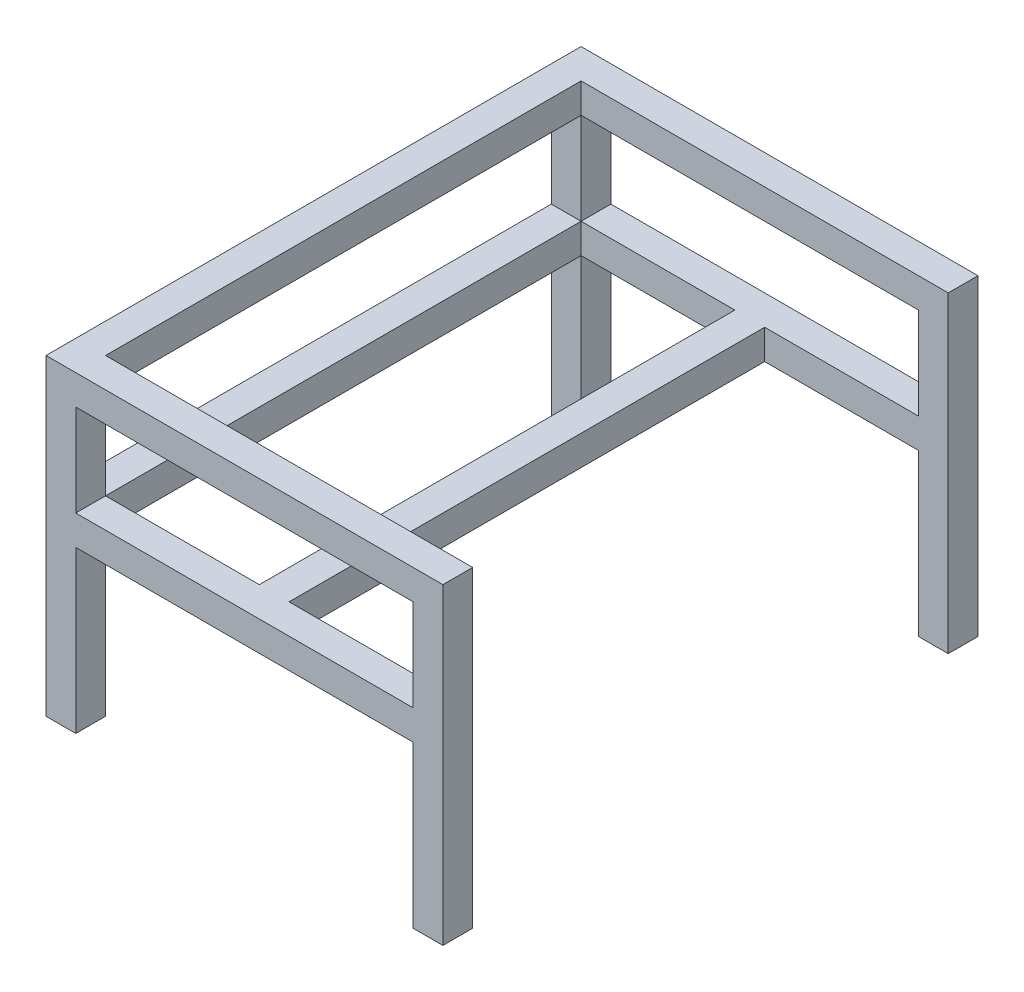
ISO-10303-21;
HEADER;
FILE_DESCRIPTION(('STEP AP214'),'2;1');
FILE_NAME('part.step','',(''),(''),'','','');
FILE_SCHEMA(('AUTOMOTIVE_DESIGN { 1 0 10303 214 1 1 1 1 }'));
ENDSEC;
DATA;
#1=APPLICATION_CONTEXT('core data for automotive mechanical design processes');
#2=APPLICATION_PROTOCOL_DEFINITION('international standard','automotive_design',2000,#1);
#3=PRODUCT_CONTEXT('',#1,'mechanical');
#4=PRODUCT('Part','Part','',(#3));
#5=PRODUCT_RELATED_PRODUCT_CATEGORY('part','',(#4));
#6=PRODUCT_DEFINITION_FORMATION('','',#4);
#7=PRODUCT_DEFINITION_CONTEXT('part definition',#1,'design');
#8=PRODUCT_DEFINITION('design','',#6,#7);
#9=PRODUCT_DEFINITION_SHAPE('','',#8);
#10=(LENGTH_UNIT() NAMED_UNIT(*) SI_UNIT(.MILLI.,.METRE.));
#11=(NAMED_UNIT(*) PLANE_ANGLE_UNIT() SI_UNIT($,.RADIAN.));
#12=(NAMED_UNIT(*) SI_UNIT($,.STERADIAN.) SOLID_ANGLE_UNIT());
#13=UNCERTAINTY_MEASURE_WITH_UNIT(LENGTH_MEASURE(1.E-05),#10,'distance_accuracy_value','');
#14=(GEOMETRIC_REPRESENTATION_CONTEXT(3) GLOBAL_UNCERTAINTY_ASSIGNED_CONTEXT((#13)) GLOBAL_UNIT_ASSIGNED_CONTEXT((#10,
#11,#12)) REPRESENTATION_CONTEXT('',''));
#15=CARTESIAN_POINT('',(0.,0.,0.));
#16=DIRECTION('',(0.,0.,1.));
#17=DIRECTION('',(1.,0.,0.));
#18=AXIS2_PLACEMENT_3D('',#15,#16,#17);
#19=CARTESIAN_POINT('',(508.1,723.8,608.8));
#20=DIRECTION('',(0.,0.,1.));
#21=DIRECTION('',(1.,0.,0.));
#22=AXIS2_PLACEMENT_3D('',#19,#20,#21);
#23=PLANE('',#22);
#24=DIRECTION('',(0.,-1.,0.));
#25=VECTOR('',#24,1.);
#26=CARTESIAN_POINT('',(-38.1,412.6,608.8));
#27=LINE('',#26,#25);
#28=CARTESIAN_POINT('',(-38.1,488.8,608.800000000001));
#29=VERTEX_POINT('',#28);
#30=CARTESIAN_POINT('',(-38.1,412.6,608.800000000001));
#31=VERTEX_POINT('',#30);
#32=EDGE_CURVE('E261',#29,#31,#27,.T.);
#33=ORIENTED_EDGE('',*,*,#32,.T.);
#34=DIRECTION('',(-1.,0.,0.));
#35=VECTOR('',#34,1.);
#36=CARTESIAN_POINT('',(431.9,412.6,608.800000000001));
#37=LINE('',#36,#35);
#38=CARTESIAN_POINT('',(-431.900000000001,412.6,608.8));
#39=VERTEX_POINT('',#38);
#40=EDGE_CURVE('E278',#31,#39,#37,.T.);
#41=ORIENTED_EDGE('',*,*,#40,.T.);
#42=DIRECTION('',(0.,1.,0.));
#43=VECTOR('',#42,1.);
#44=CARTESIAN_POINT('',(-431.900000000001,488.8,608.800000000001));
#45=LINE('',#44,#43);
#46=CARTESIAN_POINT('',(-431.9,488.8,608.800000000001));
#47=VERTEX_POINT('',#46);
#48=EDGE_CURVE('E275',#39,#47,#45,.T.);
#49=ORIENTED_EDGE('',*,*,#48,.T.);
#50=DIRECTION('',(1.,0.,0.));
#51=VECTOR('',#50,1.);
#52=CARTESIAN_POINT('',(431.9,488.8,608.800000000001));
#53=LINE('',#52,#51);
#54=EDGE_CURVE('E250',#47,#29,#53,.T.);
#55=ORIENTED_EDGE('',*,*,#54,.T.);
#56=EDGE_LOOP('',(#33,#41,#49,#55));
#57=FACE_BOUND('',#56,.T.);
#58=ADVANCED_FACE('F35',(#57),#23,.F.);
#59=DIRECTION('',(0.,1.,0.));
#60=VECTOR('',#59,1.);
#61=CARTESIAN_POINT('',(38.1,412.6,608.8));
#62=LINE('',#61,#60);
#63=CARTESIAN_POINT('',(38.1,412.6,608.800000000001));
#64=VERTEX_POINT('',#63);
#65=CARTESIAN_POINT('',(38.1,488.8,608.8));
#66=VERTEX_POINT('',#65);
#67=EDGE_CURVE('E254',#64,#66,#62,.T.);
#68=ORIENTED_EDGE('',*,*,#67,.T.);
#69=CARTESIAN_POINT('',(431.9,488.799999999999,608.8));
#70=VERTEX_POINT('',#69);
#71=EDGE_CURVE('E240',#66,#70,#53,.T.);
#72=ORIENTED_EDGE('',*,*,#71,.T.);
#73=DIRECTION('',(0.,-1.,0.));
#74=VECTOR('',#73,1.);
#75=CARTESIAN_POINT('',(431.9,723.8,608.8));
#76=LINE('',#75,#74);
#77=CARTESIAN_POINT('',(431.9,723.8,608.8));
#78=VERTEX_POINT('',#77);
#79=EDGE_CURVE('E453',#78,#70,#76,.T.);
#80=ORIENTED_EDGE('',*,*,#79,.F.);
#81=DIRECTION('',(1.,0.,0.));
#82=VECTOR('',#81,1.);
#83=CARTESIAN_POINT('',(-431.9,723.8,608.8));
#84=LINE('',#83,#82);
#85=CARTESIAN_POINT('',(-431.9,723.8,608.8));
#86=VERTEX_POINT('',#85);
#87=EDGE_CURVE('E348',#86,#78,#84,.T.);
#88=ORIENTED_EDGE('',*,*,#87,.F.);
#89=DIRECTION('',(0.,1.,0.));
#90=VECTOR('',#89,1.);
#91=CARTESIAN_POINT('',(-431.9,723.8,608.8));
#92=LINE('',#91,#90);
#93=CARTESIAN_POINT('',(-431.9,800.,608.8));
#94=VERTEX_POINT('',#93);
#95=EDGE_CURVE('E358',#86,#94,#92,.T.);
#96=ORIENTED_EDGE('',*,*,#95,.T.);
#97=DIRECTION('',(1.,0.,0.));
#98=VECTOR('',#97,1.);
#99=CARTESIAN_POINT('',(-431.9,800.,608.8));
#100=LINE('',#99,#98);
#101=CARTESIAN_POINT('',(508.1,800.,608.8));
#102=VERTEX_POINT('',#101);
#103=EDGE_CURVE('E345',#94,#102,#100,.T.);
#104=ORIENTED_EDGE('',*,*,#103,.T.);
#105=DIRECTION('',(0.,-1.,0.));
#106=VECTOR('',#105,1.);
#107=CARTESIAN_POINT('',(508.1,723.8,608.8));
#108=LINE('',#107,#106);
#109=CARTESIAN_POINT('',(508.1,0.,608.8));
#110=VERTEX_POINT('',#109);
#111=EDGE_CURVE('E413',#102,#110,#108,.T.);
#112=ORIENTED_EDGE('',*,*,#111,.T.);
#113=DIRECTION('',(-1.,0.,0.));
#114=VECTOR('',#113,1.);
#115=CARTESIAN_POINT('',(508.1,0.,608.8));
#116=LINE('',#115,#114);
#117=CARTESIAN_POINT('',(431.9,0.,608.8));
#118=VERTEX_POINT('',#117);
#119=EDGE_CURVE('E360',#110,#118,#116,.T.);
#120=ORIENTED_EDGE('',*,*,#119,.T.);
#121=CARTESIAN_POINT('',(431.9,412.6,608.800000000001));
#122=VERTEX_POINT('',#121);
#123=EDGE_CURVE('E390',#122,#118,#76,.T.);
#124=ORIENTED_EDGE('',*,*,#123,.F.);
#125=EDGE_CURVE('E251',#122,#64,#37,.T.);
#126=ORIENTED_EDGE('',*,*,#125,.T.);
#127=EDGE_LOOP('',(#68,#72,#80,#88,#96,#104,#112,#120,#124,#126));
#128=FACE_BOUND('',#127,.T.);
#129=ADVANCED_FACE('F255',(#128),#23,.F.);
#130=CARTESIAN_POINT('',(431.9,723.8,-608.8));
#131=DIRECTION('',(0.,0.,-1.));
#132=DIRECTION('',(-1.,0.,0.));
#133=AXIS2_PLACEMENT_3D('',#130,#131,#132);
#134=PLANE('',#133);
#135=DIRECTION('',(0.,-1.,0.));
#136=VECTOR('',#135,1.);
#137=CARTESIAN_POINT('',(-38.1,412.6,-608.8));
#138=LINE('',#137,#136);
#139=CARTESIAN_POINT('',(-38.1,488.8,-608.8));
#140=VERTEX_POINT('',#139);
#141=CARTESIAN_POINT('',(-38.1,412.6,-608.8));
#142=VERTEX_POINT('',#141);
#143=EDGE_CURVE('E274',#140,#142,#138,.T.);
#144=ORIENTED_EDGE('',*,*,#143,.F.);
#145=DIRECTION('',(-1.,0.,0.));
#146=VECTOR('',#145,1.);
#147=CARTESIAN_POINT('',(-431.9,488.8,-608.8));
#148=LINE('',#147,#146);
#149=CARTESIAN_POINT('',(-431.9,488.8,-608.8));
#150=VERTEX_POINT('',#149);
#151=EDGE_CURVE('E300',#140,#150,#148,.T.);
#152=ORIENTED_EDGE('',*,*,#151,.T.);
#153=DIRECTION('',(0.,-1.,0.));
#154=VECTOR('',#153,1.);
#155=CARTESIAN_POINT('',(-431.9,488.8,-608.8));
#156=LINE('',#155,#154);
#157=CARTESIAN_POINT('',(-431.9,412.6,-608.8));
#158=VERTEX_POINT('',#157);
#159=EDGE_CURVE('E297',#150,#158,#156,.T.);
#160=ORIENTED_EDGE('',*,*,#159,.T.);
#161=DIRECTION('',(1.,0.,0.));
#162=VECTOR('',#161,1.);
#163=CARTESIAN_POINT('',(-431.9,412.6,-608.8));
#164=LINE('',#163,#162);
#165=EDGE_CURVE('E58',#158,#142,#164,.T.);
#166=ORIENTED_EDGE('',*,*,#165,.T.);
#167=EDGE_LOOP('',(#144,#152,#160,#166));
#168=FACE_BOUND('',#167,.T.);
#169=ADVANCED_FACE('F550',(#168),#134,.F.);
#170=DIRECTION('',(0.,1.,0.));
#171=VECTOR('',#170,1.);
#172=CARTESIAN_POINT('',(38.1,412.6,-608.8));
#173=LINE('',#172,#171);
#174=CARTESIAN_POINT('',(38.1,412.6,-608.8));
#175=VERTEX_POINT('',#174);
#176=CARTESIAN_POINT('',(38.1,488.8,-608.8));
#177=VERTEX_POINT('',#176);
#178=EDGE_CURVE('E50',#175,#177,#173,.T.);
#179=ORIENTED_EDGE('',*,*,#178,.F.);
#180=CARTESIAN_POINT('',(431.9,412.6,-608.8));
#181=VERTEX_POINT('',#180);
#182=EDGE_CURVE('E298',#175,#181,#164,.T.);
#183=ORIENTED_EDGE('',*,*,#182,.T.);
#184=DIRECTION('',(0.,-1.,0.));
#185=VECTOR('',#184,1.);
#186=CARTESIAN_POINT('',(431.9,723.8,-608.8));
#187=LINE('',#186,#185);
#188=CARTESIAN_POINT('',(431.9,0.,-608.8));
#189=VERTEX_POINT('',#188);
#190=EDGE_CURVE('E421',#181,#189,#187,.T.);
#191=ORIENTED_EDGE('',*,*,#190,.T.);
#192=DIRECTION('',(1.,0.,0.));
#193=VECTOR('',#192,1.);
#194=CARTESIAN_POINT('',(431.9,0.,-608.8));
#195=LINE('',#194,#193);
#196=CARTESIAN_POINT('',(508.1,0.,-608.8));
#197=VERTEX_POINT('',#196);
#198=EDGE_CURVE('E366',#189,#197,#195,.T.);
#199=ORIENTED_EDGE('',*,*,#198,.T.);
#200=DIRECTION('',(0.,-1.,0.));
#201=VECTOR('',#200,1.);
#202=CARTESIAN_POINT('',(508.1,723.8,-608.8));
#203=LINE('',#202,#201);
#204=CARTESIAN_POINT('',(508.1,800.,-608.8));
#205=VERTEX_POINT('',#204);
#206=EDGE_CURVE('E416',#205,#197,#203,.T.);
#207=ORIENTED_EDGE('',*,*,#206,.F.);
#208=DIRECTION('',(-1.,0.,0.));
#209=VECTOR('',#208,1.);
#210=CARTESIAN_POINT('',(-431.9,800.,-608.8));
#211=LINE('',#210,#209);
#212=CARTESIAN_POINT('',(-431.9,800.,-608.8));
#213=VERTEX_POINT('',#212);
#214=EDGE_CURVE('E340',#205,#213,#211,.T.);
#215=ORIENTED_EDGE('',*,*,#214,.T.);
#216=DIRECTION('',(0.,1.,0.));
#217=VECTOR('',#216,1.);
#218=CARTESIAN_POINT('',(-431.9,723.8,-608.8));
#219=LINE('',#218,#217);
#220=CARTESIAN_POINT('',(-431.9,723.8,-608.800000000001));
#221=VERTEX_POINT('',#220);
#222=EDGE_CURVE('E350',#221,#213,#219,.T.);
#223=ORIENTED_EDGE('',*,*,#222,.F.);
#224=DIRECTION('',(-1.,0.,0.));
#225=VECTOR('',#224,1.);
#226=CARTESIAN_POINT('',(-431.9,723.8,-608.8));
#227=LINE('',#226,#225);
#228=CARTESIAN_POINT('',(431.9,723.799999999999,-608.8));
#229=VERTEX_POINT('',#228);
#230=EDGE_CURVE('E341',#229,#221,#227,.T.);
#231=ORIENTED_EDGE('',*,*,#230,.F.);
#232=CARTESIAN_POINT('',(431.9,488.799999999999,-608.8));
#233=VERTEX_POINT('',#232);
#234=EDGE_CURVE('E418',#229,#233,#187,.T.);
#235=ORIENTED_EDGE('',*,*,#234,.T.);
#236=EDGE_CURVE('E316',#233,#177,#148,.T.);
#237=ORIENTED_EDGE('',*,*,#236,.T.);
#238=EDGE_LOOP('',(#179,#183,#191,#199,#207,#215,#223,#231,#235,#237));
#239=FACE_BOUND('',#238,.T.);
#240=ADVANCED_FACE('F579',(#239),#134,.F.);
#241=CARTESIAN_POINT('',(508.1,800.,685.));
#242=DIRECTION('',(-1.,0.,0.));
#243=DIRECTION('',(0.,0.,1.));
#244=AXIS2_PLACEMENT_3D('',#241,#242,#243);
#245=PLANE('',#244);
#246=DIRECTION('',(0.,0.,-1.));
#247=VECTOR('',#246,1.);
#248=CARTESIAN_POINT('',(508.1,0.,685.));
#249=LINE('',#248,#247);
#250=CARTESIAN_POINT('',(508.1,0.,685.));
#251=VERTEX_POINT('',#250);
#252=EDGE_CURVE('E466',#251,#110,#249,.T.);
#253=ORIENTED_EDGE('',*,*,#252,.T.);
#254=ORIENTED_EDGE('',*,*,#111,.F.);
#255=DIRECTION('',(0.,0.,-1.));
#256=VECTOR('',#255,1.);
#257=CARTESIAN_POINT('',(508.1,800.,685.));
#258=LINE('',#257,#256);
#259=CARTESIAN_POINT('',(508.1,800.,685.));
#260=VERTEX_POINT('',#259);
#261=EDGE_CURVE('E455',#260,#102,#258,.T.);
#262=ORIENTED_EDGE('',*,*,#261,.F.);
#263=DIRECTION('',(0.,-1.,0.));
#264=VECTOR('',#263,1.);
#265=CARTESIAN_POINT('',(508.1,800.,685.));
#266=LINE('',#265,#264);
#267=EDGE_CURVE('E465',#260,#251,#266,.T.);
#268=ORIENTED_EDGE('',*,*,#267,.T.);
#269=EDGE_LOOP('',(#253,#254,#262,#268));
#270=FACE_BOUND('',#269,.T.);
#271=ADVANCED_FACE('F615',(#270),#245,.F.);
#272=CARTESIAN_POINT('',(-431.9,723.8,-608.800000000001));
#273=DIRECTION('',(-1.,0.,0.));
#274=DIRECTION('',(0.,0.,1.));
#275=AXIS2_PLACEMENT_3D('',#272,#273,#274);
#276=PLANE('',#275);
#277=DIRECTION('',(0.,-1.,0.));
#278=VECTOR('',#277,1.);
#279=CARTESIAN_POINT('',(-431.9,723.8,608.800000000001));
#280=LINE('',#279,#278);
#281=CARTESIAN_POINT('',(-431.9,0.,608.800000000001));
#282=VERTEX_POINT('',#281);
#283=EDGE_CURVE('E445',#39,#282,#280,.T.);
#284=ORIENTED_EDGE('',*,*,#283,.F.);
#285=DIRECTION('',(0.,0.,1.));
#286=VECTOR('',#285,1.);
#287=CARTESIAN_POINT('',(-431.900000000001,412.6,-258.354472974684));
#288=LINE('',#287,#286);
#289=CARTESIAN_POINT('',(-431.900000000001,412.6,685.));
#290=VERTEX_POINT('',#289);
#291=EDGE_CURVE('E288',#39,#290,#288,.T.);
#292=ORIENTED_EDGE('',*,*,#291,.T.);
#293=DIRECTION('',(0.,-1.,0.));
#294=VECTOR('',#293,1.);
#295=CARTESIAN_POINT('',(-431.9,723.8,685.));
#296=LINE('',#295,#294);
#297=CARTESIAN_POINT('',(-431.9,0.,685.));
#298=VERTEX_POINT('',#297);
#299=EDGE_CURVE('E448',#290,#298,#296,.T.);
#300=ORIENTED_EDGE('',*,*,#299,.T.);
#301=DIRECTION('',(0.,0.,-1.));
#302=VECTOR('',#301,1.);
#303=CARTESIAN_POINT('',(-431.9,0.,685.));
#304=LINE('',#303,#302);
#305=EDGE_CURVE('E396',#298,#282,#304,.T.);
#306=ORIENTED_EDGE('',*,*,#305,.T.);
#307=EDGE_LOOP('',(#284,#292,#300,#306));
#308=FACE_BOUND('',#307,.T.);
#309=ADVANCED_FACE('F603',(#308),#276,.F.);
#310=ORIENTED_EDGE('',*,*,#48,.F.);
#311=DIRECTION('',(0.,0.,-1.));
#312=VECTOR('',#311,1.);
#313=CARTESIAN_POINT('',(-431.9,412.6,-608.800000000002));
#314=LINE('',#313,#312);
#315=EDGE_CURVE('E322',#39,#158,#314,.T.);
#316=ORIENTED_EDGE('',*,*,#315,.T.);
#317=ORIENTED_EDGE('',*,*,#159,.F.);
#318=DIRECTION('',(0.,0.,1.));
#319=VECTOR('',#318,1.);
#320=CARTESIAN_POINT('',(-431.9,488.8,-608.800000000002));
#321=LINE('',#320,#319);
#322=EDGE_CURVE('E319',#150,#47,#321,.T.);
#323=ORIENTED_EDGE('',*,*,#322,.T.);
#324=EDGE_LOOP('',(#310,#316,#317,#323));
#325=FACE_BOUND('',#324,.T.);
#326=ADVANCED_FACE('F554',(#325),#276,.F.);
#327=CARTESIAN_POINT('',(431.9,723.8,608.8));
#328=DIRECTION('',(1.,0.,0.));
#329=DIRECTION('',(0.,0.,-1.));
#330=AXIS2_PLACEMENT_3D('',#327,#328,#329);
#331=PLANE('',#330);
#332=DIRECTION('',(0.,-1.,0.));
#333=VECTOR('',#332,1.);
#334=CARTESIAN_POINT('',(431.9,723.8,685.));
#335=LINE('',#334,#333);
#336=CARTESIAN_POINT('',(431.9,412.6,685.));
#337=VERTEX_POINT('',#336);
#338=CARTESIAN_POINT('',(431.9,0.,685.));
#339=VERTEX_POINT('',#338);
#340=EDGE_CURVE('E452',#337,#339,#335,.T.);
#341=ORIENTED_EDGE('',*,*,#340,.F.);
#342=DIRECTION('',(0.,0.,1.));
#343=VECTOR('',#342,1.);
#344=CARTESIAN_POINT('',(431.9,412.6,-258.354472974684));
#345=LINE('',#344,#343);
#346=EDGE_CURVE('E279',#122,#337,#345,.T.);
#347=ORIENTED_EDGE('',*,*,#346,.F.);
#348=ORIENTED_EDGE('',*,*,#123,.T.);
#349=DIRECTION('',(0.,0.,1.));
#350=VECTOR('',#349,1.);
#351=CARTESIAN_POINT('',(431.9,0.,608.8));
#352=LINE('',#351,#350);
#353=EDGE_CURVE('E393',#118,#339,#352,.T.);
#354=ORIENTED_EDGE('',*,*,#353,.T.);
#355=EDGE_LOOP('',(#341,#347,#348,#354));
#356=FACE_BOUND('',#355,.T.);
#357=ADVANCED_FACE('F607',(#356),#331,.F.);
#358=CARTESIAN_POINT('',(431.9,723.8,-685.));
#359=DIRECTION('',(1.,0.,0.));
#360=DIRECTION('',(0.,0.,-1.));
#361=AXIS2_PLACEMENT_3D('',#358,#359,#360);
#362=PLANE('',#361);
#363=ORIENTED_EDGE('',*,*,#190,.F.);
#364=DIRECTION('',(0.,0.,-1.));
#365=VECTOR('',#364,1.);
#366=CARTESIAN_POINT('',(431.9,412.6,258.354472974683));
#367=LINE('',#366,#365);
#368=CARTESIAN_POINT('',(431.9,412.6,-685.));
#369=VERTEX_POINT('',#368);
#370=EDGE_CURVE('E310',#181,#369,#367,.T.);
#371=ORIENTED_EDGE('',*,*,#370,.T.);
#372=DIRECTION('',(0.,-1.,0.));
#373=VECTOR('',#372,1.);
#374=CARTESIAN_POINT('',(431.9,723.8,-685.));
#375=LINE('',#374,#373);
#376=CARTESIAN_POINT('',(431.9,0.,-685.));
#377=VERTEX_POINT('',#376);
#378=EDGE_CURVE('E425',#369,#377,#375,.T.);
#379=ORIENTED_EDGE('',*,*,#378,.T.);
#380=DIRECTION('',(0.,0.,1.));
#381=VECTOR('',#380,1.);
#382=CARTESIAN_POINT('',(431.9,0.,-685.));
#383=LINE('',#382,#381);
#384=EDGE_CURVE('E408',#377,#189,#383,.T.);
#385=ORIENTED_EDGE('',*,*,#384,.T.);
#386=EDGE_LOOP('',(#363,#371,#379,#385));
#387=FACE_BOUND('',#386,.T.);
#388=ADVANCED_FACE('F543',(#387),#362,.F.);
#389=DIRECTION('',(0.,-1.,0.));
#390=VECTOR('',#389,1.);
#391=CARTESIAN_POINT('',(-431.9,723.8,-685.));
#392=LINE('',#391,#390);
#393=CARTESIAN_POINT('',(-431.9,412.6,-685.));
#394=VERTEX_POINT('',#393);
#395=CARTESIAN_POINT('',(-431.9,0.,-685.));
#396=VERTEX_POINT('',#395);
#397=EDGE_CURVE('E429',#394,#396,#392,.T.);
#398=ORIENTED_EDGE('',*,*,#397,.F.);
#399=DIRECTION('',(0.,0.,-1.));
#400=VECTOR('',#399,1.);
#401=CARTESIAN_POINT('',(-431.9,412.6,258.354472974683));
#402=LINE('',#401,#400);
#403=EDGE_CURVE('E307',#158,#394,#402,.T.);
#404=ORIENTED_EDGE('',*,*,#403,.F.);
#405=DIRECTION('',(0.,-1.,0.));
#406=VECTOR('',#405,1.);
#407=CARTESIAN_POINT('',(-431.9,723.8,-608.800000000001));
#408=LINE('',#407,#406);
#409=CARTESIAN_POINT('',(-431.9,0.,-608.800000000001));
#410=VERTEX_POINT('',#409);
#411=EDGE_CURVE('E433',#158,#410,#408,.T.);
#412=ORIENTED_EDGE('',*,*,#411,.T.);
#413=DIRECTION('',(0.,0.,-1.));
#414=VECTOR('',#413,1.);
#415=CARTESIAN_POINT('',(-431.9,0.,-608.800000000001));
#416=LINE('',#415,#414);
#417=EDGE_CURVE('E405',#410,#396,#416,.T.);
#418=ORIENTED_EDGE('',*,*,#417,.T.);
#419=EDGE_LOOP('',(#398,#404,#412,#418));
#420=FACE_BOUND('',#419,.T.);
#421=ADVANCED_FACE('F548',(#420),#276,.F.);
#422=CARTESIAN_POINT('',(-431.9,723.8,685.));
#423=VERTEX_POINT('',#422);
#424=CARTESIAN_POINT('',(-431.9,488.8,685.));
#425=VERTEX_POINT('',#424);
#426=EDGE_CURVE('E446',#423,#425,#296,.T.);
#427=ORIENTED_EDGE('',*,*,#426,.T.);
#428=DIRECTION('',(0.,0.,1.));
#429=VECTOR('',#428,1.);
#430=CARTESIAN_POINT('',(-431.900000000001,488.8,-258.354472974684));
#431=LINE('',#430,#429);
#432=EDGE_CURVE('E291',#47,#425,#431,.T.);
#433=ORIENTED_EDGE('',*,*,#432,.F.);
#434=EDGE_CURVE('E442',#86,#47,#280,.T.);
#435=ORIENTED_EDGE('',*,*,#434,.F.);
#436=DIRECTION('',(0.,0.,-1.));
#437=VECTOR('',#436,1.);
#438=CARTESIAN_POINT('',(-431.9,723.8,685.));
#439=LINE('',#438,#437);
#440=EDGE_CURVE('E369',#423,#86,#439,.T.);
#441=ORIENTED_EDGE('',*,*,#440,.F.);
#442=EDGE_LOOP('',(#427,#433,#435,#441));
#443=FACE_BOUND('',#442,.T.);
#444=ADVANCED_FACE('F590',(#443),#276,.F.);
#445=CARTESIAN_POINT('',(-508.1,723.8,-608.800000000001));
#446=DIRECTION('',(0.,0.,-1.));
#447=DIRECTION('',(-1.,0.,0.));
#448=AXIS2_PLACEMENT_3D('',#445,#446,#447);
#449=PLANE('',#448);
#450=DIRECTION('',(0.,-1.,0.));
#451=VECTOR('',#450,1.);
#452=CARTESIAN_POINT('',(-508.1,723.8,-608.800000000001));
#453=LINE('',#452,#451);
#454=CARTESIAN_POINT('',(-508.1,723.8,-608.800000000001));
#455=VERTEX_POINT('',#454);
#456=CARTESIAN_POINT('',(-508.1,488.8,-608.8));
#457=VERTEX_POINT('',#456);
#458=EDGE_CURVE('E434',#455,#457,#453,.T.);
#459=ORIENTED_EDGE('',*,*,#458,.T.);
#460=DIRECTION('',(-1.,0.,0.));
#461=VECTOR('',#460,1.);
#462=CARTESIAN_POINT('',(788.082049048263,488.8,-608.8));
#463=LINE('',#462,#461);
#464=EDGE_CURVE('E323',#150,#457,#463,.T.);
#465=ORIENTED_EDGE('',*,*,#464,.F.);
#466=EDGE_CURVE('E430',#221,#150,#408,.T.);
#467=ORIENTED_EDGE('',*,*,#466,.F.);
#468=DIRECTION('',(1.,0.,0.));
#469=VECTOR('',#468,1.);
#470=CARTESIAN_POINT('',(-508.1,723.8,-608.800000000001));
#471=LINE('',#470,#469);
#472=EDGE_CURVE('E378',#455,#221,#471,.T.);
#473=ORIENTED_EDGE('',*,*,#472,.F.);
#474=EDGE_LOOP('',(#459,#465,#467,#473));
#475=FACE_BOUND('',#474,.T.);
#476=ADVANCED_FACE('F562',(#475),#449,.F.);
#477=CARTESIAN_POINT('',(-431.9,723.8,608.800000000001));
#478=DIRECTION('',(0.,0.,1.));
#479=DIRECTION('',(1.,0.,0.));
#480=AXIS2_PLACEMENT_3D('',#477,#478,#479);
#481=PLANE('',#480);
#482=ORIENTED_EDGE('',*,*,#434,.T.);
#483=DIRECTION('',(-1.,0.,0.));
#484=VECTOR('',#483,1.);
#485=CARTESIAN_POINT('',(788.082049048263,488.8,608.8));
#486=LINE('',#485,#484);
#487=CARTESIAN_POINT('',(-508.1,488.8,608.800000000001));
#488=VERTEX_POINT('',#487);
#489=EDGE_CURVE('E331',#47,#488,#486,.T.);
#490=ORIENTED_EDGE('',*,*,#489,.T.);
#491=DIRECTION('',(0.,-1.,0.));
#492=VECTOR('',#491,1.);
#493=CARTESIAN_POINT('',(-508.1,723.8,608.800000000001));
#494=LINE('',#493,#492);
#495=CARTESIAN_POINT('',(-508.1,723.8,608.800000000001));
#496=VERTEX_POINT('',#495);
#497=EDGE_CURVE('E438',#496,#488,#494,.T.);
#498=ORIENTED_EDGE('',*,*,#497,.F.);
#499=DIRECTION('',(-1.,0.,0.));
#500=VECTOR('',#499,1.);
#501=CARTESIAN_POINT('',(-431.9,723.8,608.800000000001));
#502=LINE('',#501,#500);
#503=EDGE_CURVE('E372',#86,#496,#502,.T.);
#504=ORIENTED_EDGE('',*,*,#503,.F.);
#505=EDGE_LOOP('',(#482,#490,#498,#504));
#506=FACE_BOUND('',#505,.T.);
#507=ADVANCED_FACE('F592',(#506),#481,.F.);
#508=CARTESIAN_POINT('',(0.,723.8,0.));
#509=DIRECTION('',(0.,1.,0.));
#510=DIRECTION('',(0.,0.,1.));
#511=AXIS2_PLACEMENT_3D('',#508,#509,#510);
#512=PLANE('',#511);
#513=ORIENTED_EDGE('',*,*,#440,.T.);
#514=ORIENTED_EDGE('',*,*,#87,.T.);
#515=DIRECTION('',(0.,0.,1.));
#516=VECTOR('',#515,1.);
#517=CARTESIAN_POINT('',(431.9,723.8,608.8));
#518=LINE('',#517,#516);
#519=CARTESIAN_POINT('',(431.9,723.8,685.));
#520=VERTEX_POINT('',#519);
#521=EDGE_CURVE('E362',#78,#520,#518,.T.);
#522=ORIENTED_EDGE('',*,*,#521,.T.);
#523=DIRECTION('',(-1.,0.,0.));
#524=VECTOR('',#523,1.);
#525=CARTESIAN_POINT('',(-431.9,723.8,685.));
#526=LINE('',#525,#524);
#527=EDGE_CURVE('E365',#520,#423,#526,.T.);
#528=ORIENTED_EDGE('',*,*,#527,.T.);
#529=EDGE_LOOP('',(#513,#514,#522,#528));
#530=FACE_BOUND('',#529,.T.);
#531=ADVANCED_FACE('F594',(#530),#512,.F.);
#532=ORIENTED_EDGE('',*,*,#472,.T.);
#533=DIRECTION('',(0.,0.,1.));
#534=VECTOR('',#533,1.);
#535=CARTESIAN_POINT('',(-431.9,723.8,608.8));
#536=LINE('',#535,#534);
#537=EDGE_CURVE('E344',#221,#86,#536,.T.);
#538=ORIENTED_EDGE('',*,*,#537,.T.);
#539=ORIENTED_EDGE('',*,*,#503,.T.);
#540=DIRECTION('',(0.,0.,-1.));
#541=VECTOR('',#540,1.);
#542=CARTESIAN_POINT('',(-508.1,723.8,608.800000000001));
#543=LINE('',#542,#541);
#544=EDGE_CURVE('E375',#496,#455,#543,.T.);
#545=ORIENTED_EDGE('',*,*,#544,.T.);
#546=EDGE_LOOP('',(#532,#538,#539,#545));
#547=FACE_BOUND('',#546,.T.);
#548=ADVANCED_FACE('F586',(#547),#512,.F.);
#549=CARTESIAN_POINT('',(0.,0.,0.));
#550=DIRECTION('',(0.,-1.,0.));
#551=DIRECTION('',(0.,0.,-1.));
#552=AXIS2_PLACEMENT_3D('',#549,#550,#551);
#553=PLANE('',#552);
#554=ORIENTED_EDGE('',*,*,#198,.F.);
#555=ORIENTED_EDGE('',*,*,#384,.F.);
#556=DIRECTION('',(-1.,0.,0.));
#557=VECTOR('',#556,1.);
#558=CARTESIAN_POINT('',(-508.1,0.,-685.));
#559=LINE('',#558,#557);
#560=CARTESIAN_POINT('',(508.1,0.,-685.));
#561=VERTEX_POINT('',#560);
#562=EDGE_CURVE('E470',#561,#377,#559,.T.);
#563=ORIENTED_EDGE('',*,*,#562,.F.);
#564=EDGE_CURVE('E415',#197,#561,#249,.T.);
#565=ORIENTED_EDGE('',*,*,#564,.F.);
#566=EDGE_LOOP('',(#554,#555,#563,#565));
#567=FACE_BOUND('',#566,.T.);
#568=ADVANCED_FACE('F540',(#567),#553,.T.);
#569=ORIENTED_EDGE('',*,*,#417,.F.);
#570=DIRECTION('',(1.,0.,0.));
#571=VECTOR('',#570,1.);
#572=CARTESIAN_POINT('',(-508.1,0.,-608.800000000001));
#573=LINE('',#572,#571);
#574=CARTESIAN_POINT('',(-508.1,0.,-608.800000000001));
#575=VERTEX_POINT('',#574);
#576=EDGE_CURVE('E402',#575,#410,#573,.T.);
#577=ORIENTED_EDGE('',*,*,#576,.F.);
#578=DIRECTION('',(0.,0.,1.));
#579=VECTOR('',#578,1.);
#580=CARTESIAN_POINT('',(-508.1,0.,685.));
#581=LINE('',#580,#579);
#582=CARTESIAN_POINT('',(-508.1,0.,-685.));
#583=VERTEX_POINT('',#582);
#584=EDGE_CURVE('E474',#583,#575,#581,.T.);
#585=ORIENTED_EDGE('',*,*,#584,.F.);
#586=EDGE_CURVE('E469',#396,#583,#559,.T.);
#587=ORIENTED_EDGE('',*,*,#586,.F.);
#588=EDGE_LOOP('',(#569,#577,#585,#587));
#589=FACE_BOUND('',#588,.T.);
#590=ADVANCED_FACE('F500',(#589),#553,.T.);
#591=DIRECTION('',(-1.,0.,0.));
#592=VECTOR('',#591,1.);
#593=CARTESIAN_POINT('',(-431.9,0.,608.800000000001));
#594=LINE('',#593,#592);
#595=CARTESIAN_POINT('',(-508.1,0.,608.800000000001));
#596=VERTEX_POINT('',#595);
#597=EDGE_CURVE('E399',#282,#596,#594,.T.);
#598=ORIENTED_EDGE('',*,*,#597,.F.);
#599=ORIENTED_EDGE('',*,*,#305,.F.);
#600=DIRECTION('',(1.,0.,0.));
#601=VECTOR('',#600,1.);
#602=CARTESIAN_POINT('',(-508.1,0.,685.));
#603=LINE('',#602,#601);
#604=CARTESIAN_POINT('',(-508.1,0.,685.));
#605=VERTEX_POINT('',#604);
#606=EDGE_CURVE('E478',#605,#298,#603,.T.);
#607=ORIENTED_EDGE('',*,*,#606,.F.);
#608=EDGE_CURVE('E473',#596,#605,#581,.T.);
#609=ORIENTED_EDGE('',*,*,#608,.F.);
#610=EDGE_LOOP('',(#598,#599,#607,#609));
#611=FACE_BOUND('',#610,.T.);
#612=ADVANCED_FACE('F518',(#611),#553,.T.);
#613=CARTESIAN_POINT('',(508.1,800.,-685.));
#614=VERTEX_POINT('',#613);
#615=EDGE_CURVE('E459',#205,#614,#258,.T.);
#616=ORIENTED_EDGE('',*,*,#615,.F.);
#617=ORIENTED_EDGE('',*,*,#206,.T.);
#618=ORIENTED_EDGE('',*,*,#564,.T.);
#619=DIRECTION('',(0.,-1.,0.));
#620=VECTOR('',#619,1.);
#621=CARTESIAN_POINT('',(508.1,800.,-685.));
#622=LINE('',#621,#620);
#623=EDGE_CURVE('E11',#614,#561,#622,.T.);
#624=ORIENTED_EDGE('',*,*,#623,.F.);
#625=EDGE_LOOP('',(#616,#617,#618,#624));
#626=FACE_BOUND('',#625,.T.);
#627=ADVANCED_FACE('F37',(#626),#245,.F.);
#628=CARTESIAN_POINT('',(-508.1,800.,-685.));
#629=DIRECTION('',(0.,0.,1.));
#630=DIRECTION('',(1.,0.,0.));
#631=AXIS2_PLACEMENT_3D('',#628,#629,#630);
#632=PLANE('',#631);
#633=ORIENTED_EDGE('',*,*,#378,.F.);
#634=DIRECTION('',(-1.,0.,0.));
#635=VECTOR('',#634,1.);
#636=CARTESIAN_POINT('',(-431.9,412.6,-685.));
#637=LINE('',#636,#635);
#638=EDGE_CURVE('E303',#369,#394,#637,.T.);
#639=ORIENTED_EDGE('',*,*,#638,.T.);
#640=ORIENTED_EDGE('',*,*,#397,.T.);
#641=ORIENTED_EDGE('',*,*,#586,.T.);
#642=DIRECTION('',(0.,-1.,0.));
#643=VECTOR('',#642,1.);
#644=CARTESIAN_POINT('',(-508.1,800.,-685.));
#645=LINE('',#644,#643);
#646=CARTESIAN_POINT('',(-508.1,800.,-685.));
#647=VERTEX_POINT('',#646);
#648=EDGE_CURVE('E43',#647,#583,#645,.T.);
#649=ORIENTED_EDGE('',*,*,#648,.F.);
#650=DIRECTION('',(-1.,0.,0.));
#651=VECTOR('',#650,1.);
#652=CARTESIAN_POINT('',(-508.1,800.,-685.));
#653=LINE('',#652,#651);
#654=EDGE_CURVE('E458',#614,#647,#653,.T.);
#655=ORIENTED_EDGE('',*,*,#654,.F.);
#656=ORIENTED_EDGE('',*,*,#623,.T.);
#657=ORIENTED_EDGE('',*,*,#562,.T.);
#658=EDGE_LOOP('',(#633,#639,#640,#641,#649,#655,#656,#657));
#659=FACE_BOUND('',#658,.T.);
#660=DIRECTION('',(1.,0.,0.));
#661=VECTOR('',#660,1.);
#662=CARTESIAN_POINT('',(-431.9,488.8,-685.));
#663=LINE('',#662,#661);
#664=CARTESIAN_POINT('',(-431.9,488.8,-685.));
#665=VERTEX_POINT('',#664);
#666=CARTESIAN_POINT('',(431.9,488.8,-685.));
#667=VERTEX_POINT('',#666);
#668=EDGE_CURVE('E295',#665,#667,#663,.T.);
#669=ORIENTED_EDGE('',*,*,#668,.T.);
#670=CARTESIAN_POINT('',(431.9,723.8,-685.));
#671=VERTEX_POINT('',#670);
#672=EDGE_CURVE('E422',#671,#667,#375,.T.);
#673=ORIENTED_EDGE('',*,*,#672,.F.);
#674=DIRECTION('',(1.,0.,0.));
#675=VECTOR('',#674,1.);
#676=CARTESIAN_POINT('',(-431.9,723.8,-685.));
#677=LINE('',#676,#675);
#678=CARTESIAN_POINT('',(-431.9,723.8,-685.));
#679=VERTEX_POINT('',#678);
#680=EDGE_CURVE('E384',#679,#671,#677,.T.);
#681=ORIENTED_EDGE('',*,*,#680,.F.);
#682=EDGE_CURVE('E426',#679,#665,#392,.T.);
#683=ORIENTED_EDGE('',*,*,#682,.T.);
#684=EDGE_LOOP('',(#669,#673,#681,#683));
#685=FACE_BOUND('',#684,.T.);
#686=ADVANCED_FACE('F532',(#659,#685),#632,.F.);
#687=CARTESIAN_POINT('',(-508.1,800.,685.));
#688=DIRECTION('',(1.,0.,0.));
#689=DIRECTION('',(0.,0.,-1.));
#690=AXIS2_PLACEMENT_3D('',#687,#688,#689);
#691=PLANE('',#690);
#692=CARTESIAN_POINT('',(-508.1,412.6,-608.8));
#693=VERTEX_POINT('',#692);
#694=EDGE_CURVE('E437',#693,#575,#453,.T.);
#695=ORIENTED_EDGE('',*,*,#694,.F.);
#696=DIRECTION('',(0.,0.,1.));
#697=VECTOR('',#696,1.);
#698=CARTESIAN_POINT('',(-508.1,412.6,-608.8));
#699=LINE('',#698,#697);
#700=CARTESIAN_POINT('',(-508.1,412.6,608.800000000001));
#701=VERTEX_POINT('',#700);
#702=EDGE_CURVE('E318',#693,#701,#699,.T.);
#703=ORIENTED_EDGE('',*,*,#702,.T.);
#704=EDGE_CURVE('E441',#701,#596,#494,.T.);
#705=ORIENTED_EDGE('',*,*,#704,.T.);
#706=ORIENTED_EDGE('',*,*,#608,.T.);
#707=DIRECTION('',(0.,-1.,0.));
#708=VECTOR('',#707,1.);
#709=CARTESIAN_POINT('',(-508.1,800.,685.));
#710=LINE('',#709,#708);
#711=CARTESIAN_POINT('',(-508.1,800.,685.));
#712=VERTEX_POINT('',#711);
#713=EDGE_CURVE('E483',#712,#605,#710,.T.);
#714=ORIENTED_EDGE('',*,*,#713,.F.);
#715=DIRECTION('',(0.,0.,1.));
#716=VECTOR('',#715,1.);
#717=CARTESIAN_POINT('',(-508.1,800.,685.));
#718=LINE('',#717,#716);
#719=EDGE_CURVE('E461',#647,#712,#718,.T.);
#720=ORIENTED_EDGE('',*,*,#719,.F.);
#721=ORIENTED_EDGE('',*,*,#648,.T.);
#722=ORIENTED_EDGE('',*,*,#584,.T.);
#723=EDGE_LOOP('',(#695,#703,#705,#706,#714,#720,#721,#722));
#724=FACE_BOUND('',#723,.T.);
#725=DIRECTION('',(0.,0.,-1.));
#726=VECTOR('',#725,1.);
#727=CARTESIAN_POINT('',(-508.1,488.8,-608.8));
#728=LINE('',#727,#726);
#729=EDGE_CURVE('E326',#488,#457,#728,.T.);
#730=ORIENTED_EDGE('',*,*,#729,.T.);
#731=ORIENTED_EDGE('',*,*,#458,.F.);
#732=ORIENTED_EDGE('',*,*,#544,.F.);
#733=ORIENTED_EDGE('',*,*,#497,.T.);
#734=EDGE_LOOP('',(#730,#731,#732,#733));
#735=FACE_BOUND('',#734,.T.);
#736=ADVANCED_FACE('F491',(#724,#735),#691,.F.);
#737=CARTESIAN_POINT('',(-508.1,800.,685.));
#738=DIRECTION('',(0.,0.,-1.));
#739=DIRECTION('',(-1.,0.,0.));
#740=AXIS2_PLACEMENT_3D('',#737,#738,#739);
#741=PLANE('',#740);
#742=ORIENTED_EDGE('',*,*,#299,.F.);
#743=DIRECTION('',(1.,0.,0.));
#744=VECTOR('',#743,1.);
#745=CARTESIAN_POINT('',(431.9,412.6,685.));
#746=LINE('',#745,#744);
#747=EDGE_CURVE('E283',#290,#337,#746,.T.);
#748=ORIENTED_EDGE('',*,*,#747,.T.);
#749=ORIENTED_EDGE('',*,*,#340,.T.);
#750=EDGE_CURVE('E477',#339,#251,#603,.T.);
#751=ORIENTED_EDGE('',*,*,#750,.T.);
#752=ORIENTED_EDGE('',*,*,#267,.F.);
#753=DIRECTION('',(1.,0.,0.));
#754=VECTOR('',#753,1.);
#755=CARTESIAN_POINT('',(-508.1,800.,685.));
#756=LINE('',#755,#754);
#757=EDGE_CURVE('E463',#712,#260,#756,.T.);
#758=ORIENTED_EDGE('',*,*,#757,.F.);
#759=ORIENTED_EDGE('',*,*,#713,.T.);
#760=ORIENTED_EDGE('',*,*,#606,.T.);
#761=EDGE_LOOP('',(#742,#748,#749,#751,#752,#758,#759,#760));
#762=FACE_BOUND('',#761,.T.);
#763=DIRECTION('',(-1.,0.,0.));
#764=VECTOR('',#763,1.);
#765=CARTESIAN_POINT('',(431.9,488.8,685.));
#766=LINE('',#765,#764);
#767=CARTESIAN_POINT('',(431.9,488.8,685.));
#768=VERTEX_POINT('',#767);
#769=EDGE_CURVE('E260',#768,#425,#766,.T.);
#770=ORIENTED_EDGE('',*,*,#769,.T.);
#771=ORIENTED_EDGE('',*,*,#426,.F.);
#772=ORIENTED_EDGE('',*,*,#527,.F.);
#773=EDGE_CURVE('E449',#520,#768,#335,.T.);
#774=ORIENTED_EDGE('',*,*,#773,.T.);
#775=EDGE_LOOP('',(#770,#771,#772,#774));
#776=FACE_BOUND('',#775,.T.);
#777=ADVANCED_FACE('F521',(#762,#776),#741,.F.);
#778=CARTESIAN_POINT('',(0.,800.,0.));
#779=DIRECTION('',(0.,-1.,0.));
#780=DIRECTION('',(0.,0.,-1.));
#781=AXIS2_PLACEMENT_3D('',#778,#779,#780);
#782=PLANE('',#781);
#783=ORIENTED_EDGE('',*,*,#261,.T.);
#784=ORIENTED_EDGE('',*,*,#103,.F.);
#785=DIRECTION('',(0.,0.,1.));
#786=VECTOR('',#785,1.);
#787=CARTESIAN_POINT('',(-431.9,800.,608.8));
#788=LINE('',#787,#786);
#789=EDGE_CURVE('E353',#213,#94,#788,.T.);
#790=ORIENTED_EDGE('',*,*,#789,.F.);
#791=ORIENTED_EDGE('',*,*,#214,.F.);
#792=ORIENTED_EDGE('',*,*,#615,.T.);
#793=ORIENTED_EDGE('',*,*,#654,.T.);
#794=ORIENTED_EDGE('',*,*,#719,.T.);
#795=ORIENTED_EDGE('',*,*,#757,.T.);
#796=EDGE_LOOP('',(#783,#784,#790,#791,#792,#793,#794,#795));
#797=FACE_BOUND('',#796,.T.);
#798=ADVANCED_FACE('F526',(#797),#782,.F.);
#799=ORIENTED_EDGE('',*,*,#119,.F.);
#800=ORIENTED_EDGE('',*,*,#252,.F.);
#801=ORIENTED_EDGE('',*,*,#750,.F.);
#802=ORIENTED_EDGE('',*,*,#353,.F.);
#803=EDGE_LOOP('',(#799,#800,#801,#802));
#804=FACE_BOUND('',#803,.T.);
#805=ADVANCED_FACE('F613',(#804),#553,.T.);
#806=ORIENTED_EDGE('',*,*,#672,.T.);
#807=DIRECTION('',(0.,0.,-1.));
#808=VECTOR('',#807,1.);
#809=CARTESIAN_POINT('',(431.9,488.8,258.354472974683));
#810=LINE('',#809,#808);
#811=EDGE_CURVE('E313',#233,#667,#810,.T.);
#812=ORIENTED_EDGE('',*,*,#811,.F.);
#813=ORIENTED_EDGE('',*,*,#234,.F.);
#814=DIRECTION('',(0.,0.,1.));
#815=VECTOR('',#814,1.);
#816=CARTESIAN_POINT('',(431.9,723.8,-685.));
#817=LINE('',#816,#815);
#818=EDGE_CURVE('E387',#671,#229,#817,.T.);
#819=ORIENTED_EDGE('',*,*,#818,.F.);
#820=EDGE_LOOP('',(#806,#812,#813,#819));
#821=FACE_BOUND('',#820,.T.);
#822=ADVANCED_FACE('F574',(#821),#362,.F.);
#823=ORIENTED_EDGE('',*,*,#466,.T.);
#824=DIRECTION('',(0.,0.,-1.));
#825=VECTOR('',#824,1.);
#826=CARTESIAN_POINT('',(-431.9,488.8,258.354472974683));
#827=LINE('',#826,#825);
#828=EDGE_CURVE('E306',#150,#665,#827,.T.);
#829=ORIENTED_EDGE('',*,*,#828,.T.);
#830=ORIENTED_EDGE('',*,*,#682,.F.);
#831=DIRECTION('',(0.,0.,-1.));
#832=VECTOR('',#831,1.);
#833=CARTESIAN_POINT('',(-431.9,723.8,-608.800000000001));
#834=LINE('',#833,#832);
#835=EDGE_CURVE('E381',#221,#679,#834,.T.);
#836=ORIENTED_EDGE('',*,*,#835,.F.);
#837=EDGE_LOOP('',(#823,#829,#830,#836));
#838=FACE_BOUND('',#837,.T.);
#839=ADVANCED_FACE('F567',(#838),#276,.F.);
#840=ORIENTED_EDGE('',*,*,#411,.F.);
#841=DIRECTION('',(-1.,0.,0.));
#842=VECTOR('',#841,1.);
#843=CARTESIAN_POINT('',(788.082049048263,412.6,-608.8));
#844=LINE('',#843,#842);
#845=EDGE_CURVE('E329',#158,#693,#844,.T.);
#846=ORIENTED_EDGE('',*,*,#845,.T.);
#847=ORIENTED_EDGE('',*,*,#694,.T.);
#848=ORIENTED_EDGE('',*,*,#576,.T.);
#849=EDGE_LOOP('',(#840,#846,#847,#848));
#850=FACE_BOUND('',#849,.T.);
#851=ADVANCED_FACE('F502',(#850),#449,.F.);
#852=ORIENTED_EDGE('',*,*,#704,.F.);
#853=DIRECTION('',(-1.,0.,0.));
#854=VECTOR('',#853,1.);
#855=CARTESIAN_POINT('',(788.082049048263,412.6,608.8));
#856=LINE('',#855,#854);
#857=EDGE_CURVE('E333',#39,#701,#856,.T.);
#858=ORIENTED_EDGE('',*,*,#857,.F.);
#859=ORIENTED_EDGE('',*,*,#283,.T.);
#860=ORIENTED_EDGE('',*,*,#597,.T.);
#861=EDGE_LOOP('',(#852,#858,#859,#860));
#862=FACE_BOUND('',#861,.T.);
#863=ADVANCED_FACE('F511',(#862),#481,.F.);
#864=ORIENTED_EDGE('',*,*,#79,.T.);
#865=DIRECTION('',(0.,0.,1.));
#866=VECTOR('',#865,1.);
#867=CARTESIAN_POINT('',(431.9,488.8,-258.354472974684));
#868=LINE('',#867,#866);
#869=EDGE_CURVE('E246',#70,#768,#868,.T.);
#870=ORIENTED_EDGE('',*,*,#869,.T.);
#871=ORIENTED_EDGE('',*,*,#773,.F.);
#872=ORIENTED_EDGE('',*,*,#521,.F.);
#873=EDGE_LOOP('',(#864,#870,#871,#872));
#874=FACE_BOUND('',#873,.T.);
#875=ADVANCED_FACE('F617',(#874),#331,.F.);
#876=ORIENTED_EDGE('',*,*,#818,.T.);
#877=ORIENTED_EDGE('',*,*,#230,.T.);
#878=ORIENTED_EDGE('',*,*,#835,.T.);
#879=ORIENTED_EDGE('',*,*,#680,.T.);
#880=EDGE_LOOP('',(#876,#877,#878,#879));
#881=FACE_BOUND('',#880,.T.);
#882=ADVANCED_FACE('F577',(#881),#512,.F.);
#883=CARTESIAN_POINT('',(-431.9,723.8,608.8));
#884=DIRECTION('',(-1.,0.,0.));
#885=DIRECTION('',(0.,0.,1.));
#886=AXIS2_PLACEMENT_3D('',#883,#884,#885);
#887=PLANE('',#886);
#888=ORIENTED_EDGE('',*,*,#789,.T.);
#889=ORIENTED_EDGE('',*,*,#95,.F.);
#890=ORIENTED_EDGE('',*,*,#537,.F.);
#891=ORIENTED_EDGE('',*,*,#222,.T.);
#892=EDGE_LOOP('',(#888,#889,#890,#891));
#893=FACE_BOUND('',#892,.T.);
#894=ADVANCED_FACE('F582',(#893),#887,.F.);
#895=CARTESIAN_POINT('',(788.082049048263,488.8,-608.8));
#896=DIRECTION('',(0.,1.,0.));
#897=DIRECTION('',(0.,0.,1.));
#898=AXIS2_PLACEMENT_3D('',#895,#896,#897);
#899=PLANE('',#898);
#900=ORIENTED_EDGE('',*,*,#322,.F.);
#901=ORIENTED_EDGE('',*,*,#464,.T.);
#902=ORIENTED_EDGE('',*,*,#729,.F.);
#903=ORIENTED_EDGE('',*,*,#489,.F.);
#904=EDGE_LOOP('',(#900,#901,#902,#903));
#905=FACE_BOUND('',#904,.T.);
#906=ADVANCED_FACE('F558',(#905),#899,.T.);
#907=CARTESIAN_POINT('',(788.082049048263,412.6,-608.8));
#908=DIRECTION('',(0.,-1.,0.));
#909=DIRECTION('',(0.,0.,-1.));
#910=AXIS2_PLACEMENT_3D('',#907,#908,#909);
#911=PLANE('',#910);
#912=ORIENTED_EDGE('',*,*,#315,.F.);
#913=ORIENTED_EDGE('',*,*,#857,.T.);
#914=ORIENTED_EDGE('',*,*,#702,.F.);
#915=ORIENTED_EDGE('',*,*,#845,.F.);
#916=EDGE_LOOP('',(#912,#913,#914,#915));
#917=FACE_BOUND('',#916,.T.);
#918=ADVANCED_FACE('F506',(#917),#911,.T.);
#919=CARTESIAN_POINT('',(-431.9,412.6,258.354472974683));
#920=DIRECTION('',(0.,-1.,0.));
#921=DIRECTION('',(1.,0.,0.));
#922=AXIS2_PLACEMENT_3D('',#919,#920,#921);
#923=PLANE('',#922);
#924=ORIENTED_EDGE('',*,*,#165,.F.);
#925=ORIENTED_EDGE('',*,*,#403,.T.);
#926=ORIENTED_EDGE('',*,*,#638,.F.);
#927=ORIENTED_EDGE('',*,*,#370,.F.);
#928=ORIENTED_EDGE('',*,*,#182,.F.);
#929=DIRECTION('',(0.,0.,-1.));
#930=VECTOR('',#929,1.);
#931=CARTESIAN_POINT('',(38.1,412.6,716.56307345283));
#932=LINE('',#931,#930);
#933=EDGE_CURVE('E266',#64,#175,#932,.T.);
#934=ORIENTED_EDGE('',*,*,#933,.F.);
#935=ORIENTED_EDGE('',*,*,#125,.F.);
#936=ORIENTED_EDGE('',*,*,#346,.T.);
#937=ORIENTED_EDGE('',*,*,#747,.F.);
#938=ORIENTED_EDGE('',*,*,#291,.F.);
#939=ORIENTED_EDGE('',*,*,#40,.F.);
#940=DIRECTION('',(0.,0.,-1.));
#941=VECTOR('',#940,1.);
#942=CARTESIAN_POINT('',(-38.1,412.6,716.56307345283));
#943=LINE('',#942,#941);
#944=EDGE_CURVE('E948',#31,#142,#943,.T.);
#945=ORIENTED_EDGE('',*,*,#944,.T.);
#946=EDGE_LOOP('',(#924,#925,#926,#927,#928,#934,#935,#936,#937,#938,#939,#945));
#947=FACE_BOUND('',#946,.T.);
#948=ADVANCED_FACE('F546',(#947),#923,.T.);
#949=CARTESIAN_POINT('',(-431.9,488.8,258.354472974683));
#950=DIRECTION('',(0.,1.,0.));
#951=DIRECTION('',(-1.,0.,0.));
#952=AXIS2_PLACEMENT_3D('',#949,#950,#951);
#953=PLANE('',#952);
#954=ORIENTED_EDGE('',*,*,#236,.F.);
#955=ORIENTED_EDGE('',*,*,#811,.T.);
#956=ORIENTED_EDGE('',*,*,#668,.F.);
#957=ORIENTED_EDGE('',*,*,#828,.F.);
#958=ORIENTED_EDGE('',*,*,#151,.F.);
#959=DIRECTION('',(0.,0.,-1.));
#960=VECTOR('',#959,1.);
#961=CARTESIAN_POINT('',(-38.1,488.8,716.56307345283));
#962=LINE('',#961,#960);
#963=EDGE_CURVE('E271',#29,#140,#962,.T.);
#964=ORIENTED_EDGE('',*,*,#963,.F.);
#965=ORIENTED_EDGE('',*,*,#54,.F.);
#966=ORIENTED_EDGE('',*,*,#432,.T.);
#967=ORIENTED_EDGE('',*,*,#769,.F.);
#968=ORIENTED_EDGE('',*,*,#869,.F.);
#969=ORIENTED_EDGE('',*,*,#71,.F.);
#970=DIRECTION('',(0.,0.,-1.));
#971=VECTOR('',#970,1.);
#972=CARTESIAN_POINT('',(38.1,488.8,716.56307345283));
#973=LINE('',#972,#971);
#974=EDGE_CURVE('E244',#66,#177,#973,.T.);
#975=ORIENTED_EDGE('',*,*,#974,.T.);
#976=EDGE_LOOP('',(#954,#955,#956,#957,#958,#964,#965,#966,#967,#968,#969,#975));
#977=FACE_BOUND('',#976,.T.);
#978=ADVANCED_FACE('F242',(#977),#953,.T.);
#979=CARTESIAN_POINT('',(-38.1,412.6,716.56307345283));
#980=DIRECTION('',(1.,0.,0.));
#981=DIRECTION('',(0.,1.,0.));
#982=AXIS2_PLACEMENT_3D('',#979,#980,#981);
#983=PLANE('',#982);
#984=ORIENTED_EDGE('',*,*,#32,.F.);
#985=ORIENTED_EDGE('',*,*,#963,.T.);
#986=ORIENTED_EDGE('',*,*,#143,.T.);
#987=ORIENTED_EDGE('',*,*,#944,.F.);
#988=EDGE_LOOP('',(#984,#985,#986,#987));
#989=FACE_BOUND('',#988,.T.);
#990=ADVANCED_FACE('F795',(#989),#983,.F.);
#991=CARTESIAN_POINT('',(38.1,412.6,716.56307345283));
#992=DIRECTION('',(-1.,0.,0.));
#993=DIRECTION('',(0.,0.,1.));
#994=AXIS2_PLACEMENT_3D('',#991,#992,#993);
#995=PLANE('',#994);
#996=ORIENTED_EDGE('',*,*,#67,.F.);
#997=ORIENTED_EDGE('',*,*,#933,.T.);
#998=ORIENTED_EDGE('',*,*,#178,.T.);
#999=ORIENTED_EDGE('',*,*,#974,.F.);
#1000=EDGE_LOOP('',(#996,#997,#998,#999));
#1001=FACE_BOUND('',#1000,.T.);
#1002=ADVANCED_FACE('F263',(#1001),#995,.F.);
#1003=CLOSED_SHELL('',(#58,#129,#169,#240,#271,#309,#326,#357,#388,#421,#444,#476,#507,#531,
#548,#568,#590,#612,#627,#686,#736,#777,#798,#805,#822,#839,#851,#863,#875,#882,#894,#906,#918,
#948,#978,#990,#1002));
#1004=MANIFOLD_SOLID_BREP('B2',#1003);
#1005=ADVANCED_BREP_SHAPE_REPRESENTATION('',(#18,#1004),#14);
#1006=SHAPE_DEFINITION_REPRESENTATION(#9,#1005);
ENDSEC;
END-ISO-10303-21;
